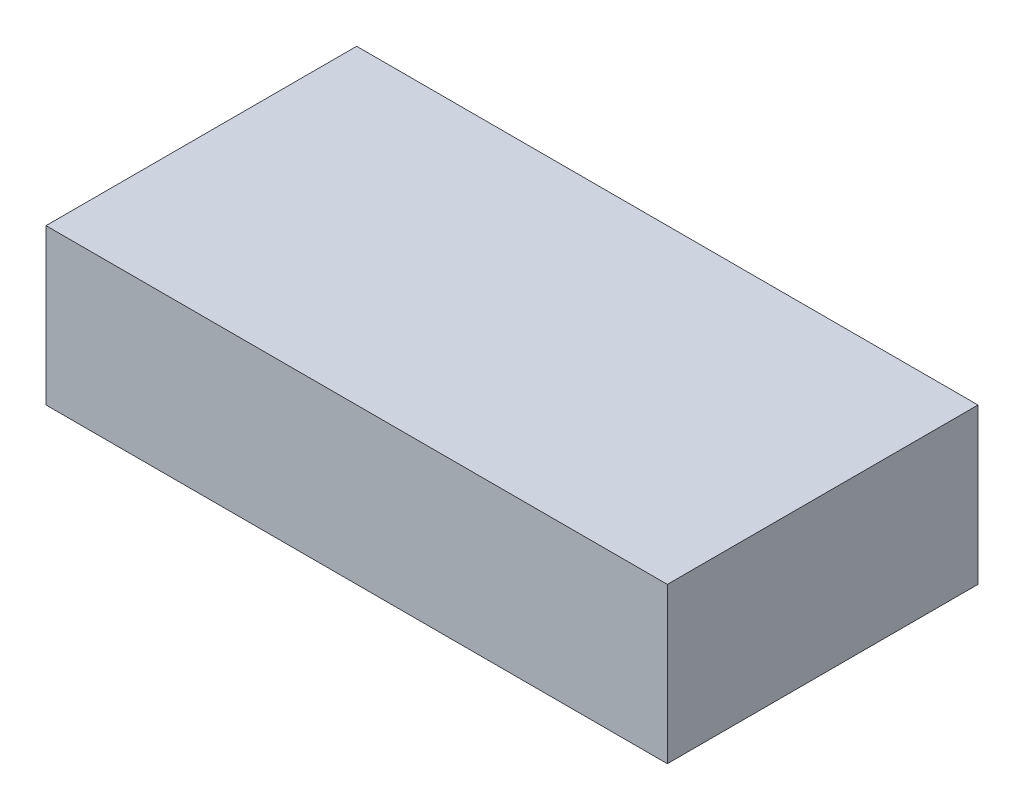
ISO-10303-21;
HEADER;
FILE_DESCRIPTION(('STEP AP214'),'2;1');
FILE_NAME('part.step','',(''),(''),'','','');
FILE_SCHEMA(('AUTOMOTIVE_DESIGN { 1 0 10303 214 1 1 1 1 }'));
ENDSEC;
DATA;
#1=APPLICATION_CONTEXT('core data for automotive mechanical design processes');
#2=APPLICATION_PROTOCOL_DEFINITION('international standard','automotive_design',2000,#1);
#3=PRODUCT_CONTEXT('',#1,'mechanical');
#4=PRODUCT('Part','Part','',(#3));
#5=PRODUCT_RELATED_PRODUCT_CATEGORY('part','',(#4));
#6=PRODUCT_DEFINITION_FORMATION('','',#4);
#7=PRODUCT_DEFINITION_CONTEXT('part definition',#1,'design');
#8=PRODUCT_DEFINITION('design','',#6,#7);
#9=PRODUCT_DEFINITION_SHAPE('','',#8);
#10=(LENGTH_UNIT() NAMED_UNIT(*) SI_UNIT(.MILLI.,.METRE.));
#11=(NAMED_UNIT(*) PLANE_ANGLE_UNIT() SI_UNIT($,.RADIAN.));
#12=(NAMED_UNIT(*) SI_UNIT($,.STERADIAN.) SOLID_ANGLE_UNIT());
#13=UNCERTAINTY_MEASURE_WITH_UNIT(LENGTH_MEASURE(1.E-05),#10,'distance_accuracy_value','');
#14=(GEOMETRIC_REPRESENTATION_CONTEXT(3) GLOBAL_UNCERTAINTY_ASSIGNED_CONTEXT((#13)) GLOBAL_UNIT_ASSIGNED_CONTEXT((#10,
#11,#12)) REPRESENTATION_CONTEXT('',''));
#15=CARTESIAN_POINT('',(0.,0.,0.));
#16=DIRECTION('',(0.,0.,1.));
#17=DIRECTION('',(1.,0.,0.));
#18=AXIS2_PLACEMENT_3D('',#15,#16,#17);
#19=CARTESIAN_POINT('',(1218.,1628.,-800.));
#20=DIRECTION('',(-1.,0.,0.));
#21=DIRECTION('',(0.,0.,1.));
#22=AXIS2_PLACEMENT_3D('',#19,#20,#21);
#23=PLANE('',#22);
#24=DIRECTION('',(0.,-1.,0.));
#25=VECTOR('',#24,1.);
#26=CARTESIAN_POINT('',(1218.,1628.,-760.));
#27=LINE('',#26,#25);
#28=CARTESIAN_POINT('',(1218.,1648.,-760.));
#29=VERTEX_POINT('',#28);
#30=CARTESIAN_POINT('',(1218.,1628.,-760.));
#31=VERTEX_POINT('',#30);
#32=EDGE_CURVE('E103',#29,#31,#27,.T.);
#33=ORIENTED_EDGE('',*,*,#32,.F.);
#34=DIRECTION('',(0.,0.,1.));
#35=VECTOR('',#34,1.);
#36=CARTESIAN_POINT('',(1218.,1648.,-800.));
#37=LINE('',#36,#35);
#38=CARTESIAN_POINT('',(1218.,1648.,-800.));
#39=VERTEX_POINT('',#38);
#40=EDGE_CURVE('E11',#39,#29,#37,.T.);
#41=ORIENTED_EDGE('',*,*,#40,.F.);
#42=DIRECTION('',(0.,-1.,0.));
#43=VECTOR('',#42,1.);
#44=CARTESIAN_POINT('',(1218.,1628.,-800.));
#45=LINE('',#44,#43);
#46=CARTESIAN_POINT('',(1218.,1628.,-800.));
#47=VERTEX_POINT('',#46);
#48=EDGE_CURVE('E97',#39,#47,#45,.T.);
#49=ORIENTED_EDGE('',*,*,#48,.T.);
#50=DIRECTION('',(0.,0.,1.));
#51=VECTOR('',#50,1.);
#52=CARTESIAN_POINT('',(1218.,1628.,-800.));
#53=LINE('',#52,#51);
#54=EDGE_CURVE('E42',#47,#31,#53,.T.);
#55=ORIENTED_EDGE('',*,*,#54,.T.);
#56=EDGE_LOOP('',(#33,#41,#49,#55));
#57=FACE_BOUND('',#56,.T.);
#58=ADVANCED_FACE('F39',(#57),#23,.T.);
#59=CARTESIAN_POINT('',(1218.,1648.,-800.));
#60=DIRECTION('',(0.,1.,0.));
#61=DIRECTION('',(0.,0.,1.));
#62=AXIS2_PLACEMENT_3D('',#59,#60,#61);
#63=PLANE('',#62);
#64=DIRECTION('',(-1.,0.,0.));
#65=VECTOR('',#64,1.);
#66=CARTESIAN_POINT('',(1218.,1648.,-760.));
#67=LINE('',#66,#65);
#68=CARTESIAN_POINT('',(1298.,1648.,-760.));
#69=VERTEX_POINT('',#68);
#70=EDGE_CURVE('E99',#69,#29,#67,.T.);
#71=ORIENTED_EDGE('',*,*,#70,.F.);
#72=DIRECTION('',(0.,0.,1.));
#73=VECTOR('',#72,1.);
#74=CARTESIAN_POINT('',(1298.,1648.,-800.));
#75=LINE('',#74,#73);
#76=CARTESIAN_POINT('',(1298.,1648.,-800.));
#77=VERTEX_POINT('',#76);
#78=EDGE_CURVE('E48',#77,#69,#75,.T.);
#79=ORIENTED_EDGE('',*,*,#78,.F.);
#80=DIRECTION('',(-1.,0.,0.));
#81=VECTOR('',#80,1.);
#82=CARTESIAN_POINT('',(1218.,1648.,-800.));
#83=LINE('',#82,#81);
#84=EDGE_CURVE('E94',#77,#39,#83,.T.);
#85=ORIENTED_EDGE('',*,*,#84,.T.);
#86=ORIENTED_EDGE('',*,*,#40,.T.);
#87=EDGE_LOOP('',(#71,#79,#85,#86));
#88=FACE_BOUND('',#87,.T.);
#89=ADVANCED_FACE('F113',(#88),#63,.T.);
#90=CARTESIAN_POINT('',(1298.,1628.,-800.));
#91=DIRECTION('',(1.,0.,0.));
#92=DIRECTION('',(0.,0.,-1.));
#93=AXIS2_PLACEMENT_3D('',#90,#91,#92);
#94=PLANE('',#93);
#95=DIRECTION('',(0.,1.,0.));
#96=VECTOR('',#95,1.);
#97=CARTESIAN_POINT('',(1298.,1628.,-760.));
#98=LINE('',#97,#96);
#99=CARTESIAN_POINT('',(1298.,1628.,-760.));
#100=VERTEX_POINT('',#99);
#101=EDGE_CURVE('E89',#100,#69,#98,.T.);
#102=ORIENTED_EDGE('',*,*,#101,.F.);
#103=DIRECTION('',(0.,0.,1.));
#104=VECTOR('',#103,1.);
#105=CARTESIAN_POINT('',(1298.,1628.,-800.));
#106=LINE('',#105,#104);
#107=CARTESIAN_POINT('',(1298.,1628.,-800.));
#108=VERTEX_POINT('',#107);
#109=EDGE_CURVE('E84',#108,#100,#106,.T.);
#110=ORIENTED_EDGE('',*,*,#109,.F.);
#111=DIRECTION('',(0.,1.,0.));
#112=VECTOR('',#111,1.);
#113=CARTESIAN_POINT('',(1298.,1628.,-800.));
#114=LINE('',#113,#112);
#115=EDGE_CURVE('E87',#108,#77,#114,.T.);
#116=ORIENTED_EDGE('',*,*,#115,.T.);
#117=ORIENTED_EDGE('',*,*,#78,.T.);
#118=EDGE_LOOP('',(#102,#110,#116,#117));
#119=FACE_BOUND('',#118,.T.);
#120=ADVANCED_FACE('F86',(#119),#94,.T.);
#121=CARTESIAN_POINT('',(1218.,1628.,-800.));
#122=DIRECTION('',(0.,-1.,0.));
#123=DIRECTION('',(0.,0.,-1.));
#124=AXIS2_PLACEMENT_3D('',#121,#122,#123);
#125=PLANE('',#124);
#126=DIRECTION('',(1.,0.,0.));
#127=VECTOR('',#126,1.);
#128=CARTESIAN_POINT('',(1218.,1628.,-760.));
#129=LINE('',#128,#127);
#130=EDGE_CURVE('E106',#31,#100,#129,.T.);
#131=ORIENTED_EDGE('',*,*,#130,.F.);
#132=ORIENTED_EDGE('',*,*,#54,.F.);
#133=DIRECTION('',(1.,0.,0.));
#134=VECTOR('',#133,1.);
#135=CARTESIAN_POINT('',(1218.,1628.,-800.));
#136=LINE('',#135,#134);
#137=EDGE_CURVE('E93',#47,#108,#136,.T.);
#138=ORIENTED_EDGE('',*,*,#137,.T.);
#139=ORIENTED_EDGE('',*,*,#109,.T.);
#140=EDGE_LOOP('',(#131,#132,#138,#139));
#141=FACE_BOUND('',#140,.T.);
#142=ADVANCED_FACE('F96',(#141),#125,.T.);
#143=CARTESIAN_POINT('',(0.,0.,-800.));
#144=DIRECTION('',(0.,0.,-1.));
#145=DIRECTION('',(-1.,0.,0.));
#146=AXIS2_PLACEMENT_3D('',#143,#144,#145);
#147=PLANE('',#146);
#148=ORIENTED_EDGE('',*,*,#48,.F.);
#149=ORIENTED_EDGE('',*,*,#84,.F.);
#150=ORIENTED_EDGE('',*,*,#115,.F.);
#151=ORIENTED_EDGE('',*,*,#137,.F.);
#152=EDGE_LOOP('',(#148,#149,#150,#151));
#153=FACE_BOUND('',#152,.T.);
#154=ADVANCED_FACE('F92',(#153),#147,.T.);
#155=CARTESIAN_POINT('',(0.,0.,-760.));
#156=DIRECTION('',(0.,0.,-1.));
#157=DIRECTION('',(-1.,0.,0.));
#158=AXIS2_PLACEMENT_3D('',#155,#156,#157);
#159=PLANE('',#158);
#160=ORIENTED_EDGE('',*,*,#32,.T.);
#161=ORIENTED_EDGE('',*,*,#130,.T.);
#162=ORIENTED_EDGE('',*,*,#101,.T.);
#163=ORIENTED_EDGE('',*,*,#70,.T.);
#164=EDGE_LOOP('',(#160,#161,#162,#163));
#165=FACE_BOUND('',#164,.T.);
#166=ADVANCED_FACE('F112',(#165),#159,.F.);
#167=CLOSED_SHELL('',(#58,#89,#120,#142,#154,#166));
#168=MANIFOLD_SOLID_BREP('B2',#167);
#169=ADVANCED_BREP_SHAPE_REPRESENTATION('',(#18,#168),#14);
#170=SHAPE_DEFINITION_REPRESENTATION(#9,#169);
ENDSEC;
END-ISO-10303-21;
